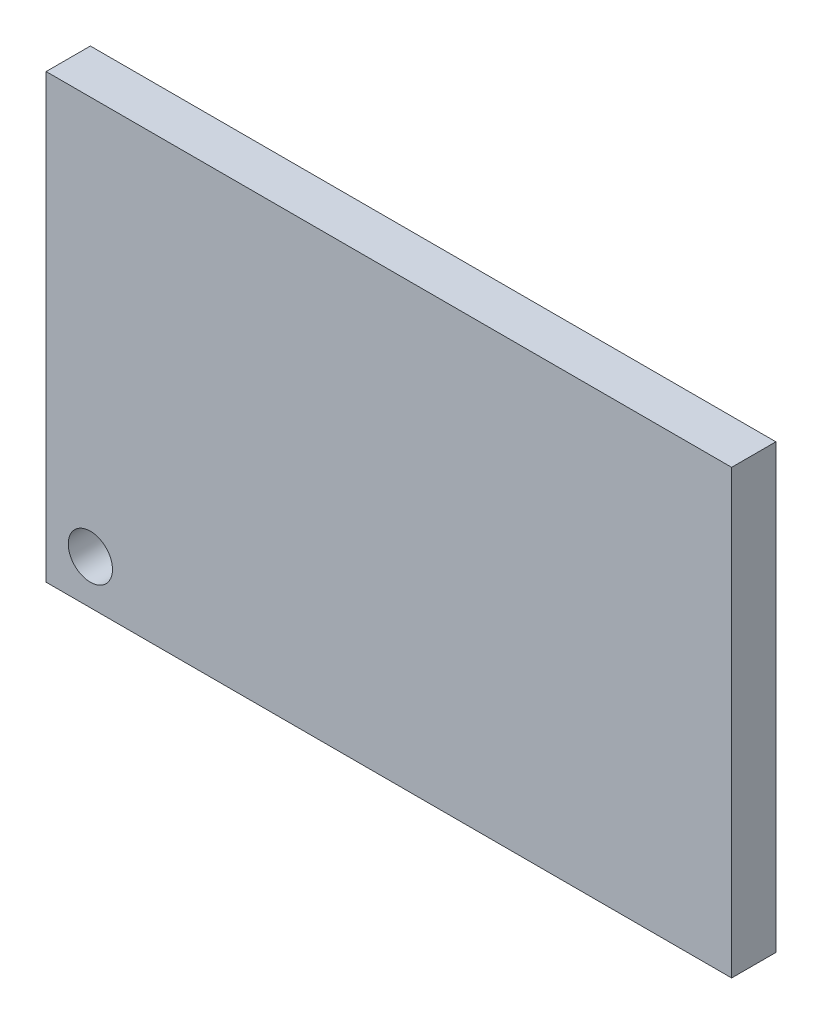
ISO-10303-21;
HEADER;
FILE_DESCRIPTION(('STEP AP214'),'2;1');
FILE_NAME('part.step','',(''),(''),'','','');
FILE_SCHEMA(('AUTOMOTIVE_DESIGN { 1 0 10303 214 1 1 1 1 }'));
ENDSEC;
DATA;
#1=APPLICATION_CONTEXT('core data for automotive mechanical design processes');
#2=APPLICATION_PROTOCOL_DEFINITION('international standard','automotive_design',2000,#1);
#3=PRODUCT_CONTEXT('',#1,'mechanical');
#4=PRODUCT('Part','Part','',(#3));
#5=PRODUCT_RELATED_PRODUCT_CATEGORY('part','',(#4));
#6=PRODUCT_DEFINITION_FORMATION('','',#4);
#7=PRODUCT_DEFINITION_CONTEXT('part definition',#1,'design');
#8=PRODUCT_DEFINITION('design','',#6,#7);
#9=PRODUCT_DEFINITION_SHAPE('','',#8);
#10=(LENGTH_UNIT() NAMED_UNIT(*) SI_UNIT(.MILLI.,.METRE.));
#11=(NAMED_UNIT(*) PLANE_ANGLE_UNIT() SI_UNIT($,.RADIAN.));
#12=(NAMED_UNIT(*) SI_UNIT($,.STERADIAN.) SOLID_ANGLE_UNIT());
#13=UNCERTAINTY_MEASURE_WITH_UNIT(LENGTH_MEASURE(1.E-05),#10,'distance_accuracy_value','');
#14=(GEOMETRIC_REPRESENTATION_CONTEXT(3) GLOBAL_UNCERTAINTY_ASSIGNED_CONTEXT((#13)) GLOBAL_UNIT_ASSIGNED_CONTEXT((#10,
#11,#12)) REPRESENTATION_CONTEXT('',''));
#15=CARTESIAN_POINT('',(0.,0.,0.));
#16=DIRECTION('',(0.,0.,1.));
#17=DIRECTION('',(1.,0.,0.));
#18=AXIS2_PLACEMENT_3D('',#15,#16,#17);
#19=CARTESIAN_POINT('',(-77.5,50.,10.));
#20=DIRECTION('',(1.,0.,0.));
#21=DIRECTION('',(0.,1.,0.));
#22=AXIS2_PLACEMENT_3D('',#19,#20,#21);
#23=PLANE('',#22);
#24=DIRECTION('',(0.,-1.,0.));
#25=VECTOR('',#24,1.);
#26=CARTESIAN_POINT('',(-77.5,50.,0.));
#27=LINE('',#26,#25);
#28=CARTESIAN_POINT('',(-77.5,50.,0.));
#29=VERTEX_POINT('',#28);
#30=CARTESIAN_POINT('',(-77.5,-50.,0.));
#31=VERTEX_POINT('',#30);
#32=EDGE_CURVE('E96',#29,#31,#27,.T.);
#33=ORIENTED_EDGE('',*,*,#32,.T.);
#34=DIRECTION('',(0.,0.,-1.));
#35=VECTOR('',#34,1.);
#36=CARTESIAN_POINT('',(-77.5,-50.,10.));
#37=LINE('',#36,#35);
#38=CARTESIAN_POINT('',(-77.5,-50.,10.));
#39=VERTEX_POINT('',#38);
#40=EDGE_CURVE('E11',#39,#31,#37,.T.);
#41=ORIENTED_EDGE('',*,*,#40,.F.);
#42=DIRECTION('',(0.,-1.,0.));
#43=VECTOR('',#42,1.);
#44=CARTESIAN_POINT('',(-77.5,50.,10.));
#45=LINE('',#44,#43);
#46=CARTESIAN_POINT('',(-77.5,50.,10.));
#47=VERTEX_POINT('',#46);
#48=EDGE_CURVE('E84',#47,#39,#45,.T.);
#49=ORIENTED_EDGE('',*,*,#48,.F.);
#50=DIRECTION('',(0.,0.,-1.));
#51=VECTOR('',#50,1.);
#52=CARTESIAN_POINT('',(-77.5,50.,10.));
#53=LINE('',#52,#51);
#54=EDGE_CURVE('E92',#47,#29,#53,.T.);
#55=ORIENTED_EDGE('',*,*,#54,.T.);
#56=EDGE_LOOP('',(#33,#41,#49,#55));
#57=FACE_BOUND('',#56,.T.);
#58=ADVANCED_FACE('F33',(#57),#23,.F.);
#59=CARTESIAN_POINT('',(77.5,-50.,10.));
#60=DIRECTION('',(0.,1.,0.));
#61=DIRECTION('',(-1.,0.,0.));
#62=AXIS2_PLACEMENT_3D('',#59,#60,#61);
#63=PLANE('',#62);
#64=DIRECTION('',(1.,0.,0.));
#65=VECTOR('',#64,1.);
#66=CARTESIAN_POINT('',(77.5,-50.,0.));
#67=LINE('',#66,#65);
#68=CARTESIAN_POINT('',(77.5,-50.,0.));
#69=VERTEX_POINT('',#68);
#70=EDGE_CURVE('E88',#31,#69,#67,.T.);
#71=ORIENTED_EDGE('',*,*,#70,.T.);
#72=DIRECTION('',(0.,0.,-1.));
#73=VECTOR('',#72,1.);
#74=CARTESIAN_POINT('',(77.5,-50.,10.));
#75=LINE('',#74,#73);
#76=CARTESIAN_POINT('',(77.5,-50.,10.));
#77=VERTEX_POINT('',#76);
#78=EDGE_CURVE('E41',#77,#69,#75,.T.);
#79=ORIENTED_EDGE('',*,*,#78,.F.);
#80=DIRECTION('',(1.,0.,0.));
#81=VECTOR('',#80,1.);
#82=CARTESIAN_POINT('',(77.5,-50.,10.));
#83=LINE('',#82,#81);
#84=EDGE_CURVE('E79',#39,#77,#83,.T.);
#85=ORIENTED_EDGE('',*,*,#84,.F.);
#86=ORIENTED_EDGE('',*,*,#40,.T.);
#87=EDGE_LOOP('',(#71,#79,#85,#86));
#88=FACE_BOUND('',#87,.T.);
#89=ADVANCED_FACE('F87',(#88),#63,.F.);
#90=CARTESIAN_POINT('',(77.5,50.,10.));
#91=DIRECTION('',(-1.,0.,0.));
#92=DIRECTION('',(0.,0.,1.));
#93=AXIS2_PLACEMENT_3D('',#90,#91,#92);
#94=PLANE('',#93);
#95=DIRECTION('',(0.,1.,0.));
#96=VECTOR('',#95,1.);
#97=CARTESIAN_POINT('',(77.5,50.,0.));
#98=LINE('',#97,#96);
#99=CARTESIAN_POINT('',(77.5,50.,0.));
#100=VERTEX_POINT('',#99);
#101=EDGE_CURVE('E66',#69,#100,#98,.T.);
#102=ORIENTED_EDGE('',*,*,#101,.T.);
#103=DIRECTION('',(0.,0.,-1.));
#104=VECTOR('',#103,1.);
#105=CARTESIAN_POINT('',(77.5,50.,10.));
#106=LINE('',#105,#104);
#107=CARTESIAN_POINT('',(77.5,50.,10.));
#108=VERTEX_POINT('',#107);
#109=EDGE_CURVE('E89',#108,#100,#106,.T.);
#110=ORIENTED_EDGE('',*,*,#109,.F.);
#111=DIRECTION('',(0.,1.,0.));
#112=VECTOR('',#111,1.);
#113=CARTESIAN_POINT('',(77.5,50.,10.));
#114=LINE('',#113,#112);
#115=EDGE_CURVE('E82',#77,#108,#114,.T.);
#116=ORIENTED_EDGE('',*,*,#115,.F.);
#117=ORIENTED_EDGE('',*,*,#78,.T.);
#118=EDGE_LOOP('',(#102,#110,#116,#117));
#119=FACE_BOUND('',#118,.T.);
#120=ADVANCED_FACE('F90',(#119),#94,.F.);
#121=CARTESIAN_POINT('',(77.5,50.,10.));
#122=DIRECTION('',(0.,-1.,0.));
#123=DIRECTION('',(1.,0.,0.));
#124=AXIS2_PLACEMENT_3D('',#121,#122,#123);
#125=PLANE('',#124);
#126=DIRECTION('',(-1.,0.,0.));
#127=VECTOR('',#126,1.);
#128=CARTESIAN_POINT('',(77.5,50.,0.));
#129=LINE('',#128,#127);
#130=EDGE_CURVE('E72',#100,#29,#129,.T.);
#131=ORIENTED_EDGE('',*,*,#130,.T.);
#132=ORIENTED_EDGE('',*,*,#54,.F.);
#133=DIRECTION('',(-1.,0.,0.));
#134=VECTOR('',#133,1.);
#135=CARTESIAN_POINT('',(77.5,50.,10.));
#136=LINE('',#135,#134);
#137=EDGE_CURVE('E49',#108,#47,#136,.T.);
#138=ORIENTED_EDGE('',*,*,#137,.F.);
#139=ORIENTED_EDGE('',*,*,#109,.T.);
#140=EDGE_LOOP('',(#131,#132,#138,#139));
#141=FACE_BOUND('',#140,.T.);
#142=ADVANCED_FACE('F104',(#141),#125,.F.);
#143=CARTESIAN_POINT('',(0.,0.,10.));
#144=DIRECTION('',(0.,0.,-1.));
#145=DIRECTION('',(-1.,0.,0.));
#146=AXIS2_PLACEMENT_3D('',#143,#144,#145);
#147=PLANE('',#146);
#148=CARTESIAN_POINT('',(-67.5,-40.,10.));
#149=DIRECTION('',(0.,0.,1.));
#150=DIRECTION('',(1.,0.,0.));
#151=AXIS2_PLACEMENT_3D('',#148,#149,#150);
#152=CIRCLE('',#151,5.00000000000001);
#153=CARTESIAN_POINT('',(-62.5,-40.,10.));
#154=VERTEX_POINT('',#153);
#155=EDGE_CURVE('E110',#154,#154,#152,.T.);
#156=ORIENTED_EDGE('',*,*,#155,.F.);
#157=EDGE_LOOP('',(#156));
#158=FACE_BOUND('',#157,.T.);
#159=ORIENTED_EDGE('',*,*,#48,.T.);
#160=ORIENTED_EDGE('',*,*,#84,.T.);
#161=ORIENTED_EDGE('',*,*,#115,.T.);
#162=ORIENTED_EDGE('',*,*,#137,.T.);
#163=EDGE_LOOP('',(#159,#160,#161,#162));
#164=FACE_BOUND('',#163,.T.);
#165=ADVANCED_FACE('F80',(#158,#164),#147,.F.);
#166=CARTESIAN_POINT('',(0.,0.,0.));
#167=DIRECTION('',(0.,0.,-1.));
#168=DIRECTION('',(-1.,0.,0.));
#169=AXIS2_PLACEMENT_3D('',#166,#167,#168);
#170=PLANE('',#169);
#171=CARTESIAN_POINT('',(-67.5,-40.,0.));
#172=DIRECTION('',(0.,0.,1.));
#173=DIRECTION('',(1.,0.,0.));
#174=AXIS2_PLACEMENT_3D('',#171,#172,#173);
#175=CIRCLE('',#174,5.00000000000001);
#176=CARTESIAN_POINT('',(-62.5,-40.,0.));
#177=VERTEX_POINT('',#176);
#178=EDGE_CURVE('E99',#177,#177,#175,.T.);
#179=ORIENTED_EDGE('',*,*,#178,.T.);
#180=EDGE_LOOP('',(#179));
#181=FACE_BOUND('',#180,.T.);
#182=ORIENTED_EDGE('',*,*,#32,.F.);
#183=ORIENTED_EDGE('',*,*,#130,.F.);
#184=ORIENTED_EDGE('',*,*,#101,.F.);
#185=ORIENTED_EDGE('',*,*,#70,.F.);
#186=EDGE_LOOP('',(#182,#183,#184,#185));
#187=FACE_BOUND('',#186,.T.);
#188=ADVANCED_FACE('F107',(#181,#187),#170,.T.);
#189=CARTESIAN_POINT('',(-67.5,-40.,0.));
#190=DIRECTION('',(0.,0.,1.));
#191=DIRECTION('',(1.,0.,0.));
#192=AXIS2_PLACEMENT_3D('',#189,#190,#191);
#193=CYLINDRICAL_SURFACE('',#192,5.00000000000001);
#194=ORIENTED_EDGE('',*,*,#178,.F.);
#195=EDGE_LOOP('',(#194));
#196=FACE_BOUND('',#195,.T.);
#197=ORIENTED_EDGE('',*,*,#155,.T.);
#198=EDGE_LOOP('',(#197));
#199=FACE_BOUND('',#198,.T.);
#200=ADVANCED_FACE('F117',(#196,#199),#193,.F.);
#201=CLOSED_SHELL('',(#58,#89,#120,#142,#165,#188,#200));
#202=MANIFOLD_SOLID_BREP('B2',#201);
#203=ADVANCED_BREP_SHAPE_REPRESENTATION('',(#18,#202),#14);
#204=SHAPE_DEFINITION_REPRESENTATION(#9,#203);
ENDSEC;
END-ISO-10303-21;
